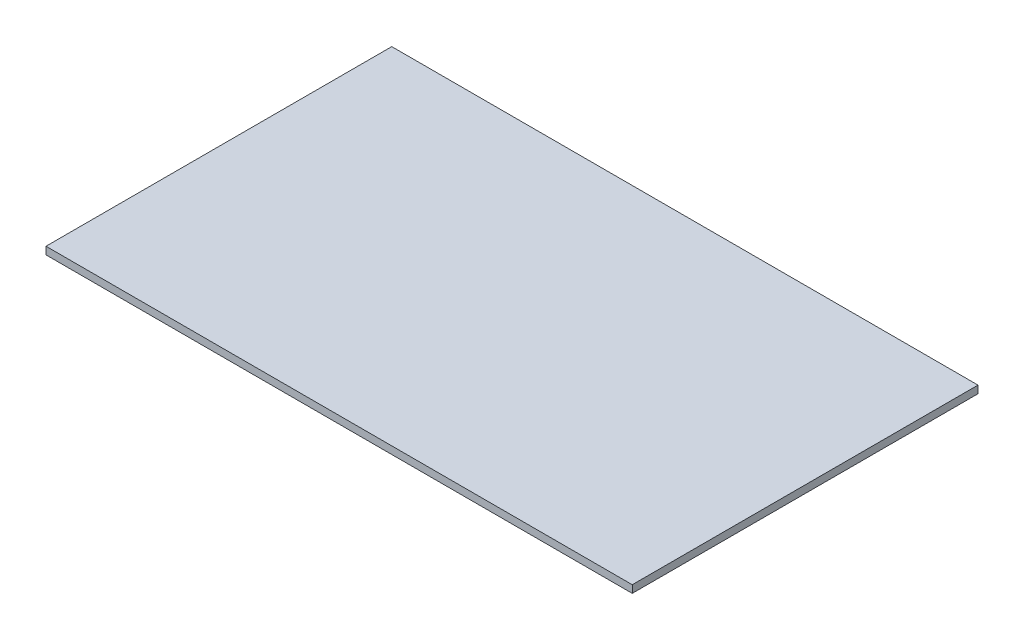
ISO-10303-21;
HEADER;
FILE_DESCRIPTION(('STEP AP214'),'2;1');
FILE_NAME('part.step','',(''),(''),'','','');
FILE_SCHEMA(('AUTOMOTIVE_DESIGN { 1 0 10303 214 1 1 1 1 }'));
ENDSEC;
DATA;
#1=APPLICATION_CONTEXT('core data for automotive mechanical design processes');
#2=APPLICATION_PROTOCOL_DEFINITION('international standard','automotive_design',2000,#1);
#3=PRODUCT_CONTEXT('',#1,'mechanical');
#4=PRODUCT('Part','Part','',(#3));
#5=PRODUCT_RELATED_PRODUCT_CATEGORY('part','',(#4));
#6=PRODUCT_DEFINITION_FORMATION('','',#4);
#7=PRODUCT_DEFINITION_CONTEXT('part definition',#1,'design');
#8=PRODUCT_DEFINITION('design','',#6,#7);
#9=PRODUCT_DEFINITION_SHAPE('','',#8);
#10=(LENGTH_UNIT() NAMED_UNIT(*) SI_UNIT(.MILLI.,.METRE.));
#11=(NAMED_UNIT(*) PLANE_ANGLE_UNIT() SI_UNIT($,.RADIAN.));
#12=(NAMED_UNIT(*) SI_UNIT($,.STERADIAN.) SOLID_ANGLE_UNIT());
#13=UNCERTAINTY_MEASURE_WITH_UNIT(LENGTH_MEASURE(1.E-05),#10,'distance_accuracy_value','');
#14=(GEOMETRIC_REPRESENTATION_CONTEXT(3) GLOBAL_UNCERTAINTY_ASSIGNED_CONTEXT((#13)) GLOBAL_UNIT_ASSIGNED_CONTEXT((#10,
#11,#12)) REPRESENTATION_CONTEXT('',''));
#15=CARTESIAN_POINT('',(0.,0.,0.));
#16=DIRECTION('',(0.,0.,1.));
#17=DIRECTION('',(1.,0.,0.));
#18=AXIS2_PLACEMENT_3D('',#15,#16,#17);
#19=CARTESIAN_POINT('',(39.,1.,-23.));
#20=DIRECTION('',(-1.,0.,0.));
#21=DIRECTION('',(0.,0.,1.));
#22=AXIS2_PLACEMENT_3D('',#19,#20,#21);
#23=PLANE('',#22);
#24=DIRECTION('',(0.,0.,-1.));
#25=VECTOR('',#24,1.);
#26=CARTESIAN_POINT('',(39.,0.,-23.));
#27=LINE('',#26,#25);
#28=CARTESIAN_POINT('',(39.,0.,23.));
#29=VERTEX_POINT('',#28);
#30=CARTESIAN_POINT('',(39.,0.,-23.));
#31=VERTEX_POINT('',#30);
#32=EDGE_CURVE('E96',#29,#31,#27,.T.);
#33=ORIENTED_EDGE('',*,*,#32,.T.);
#34=DIRECTION('',(0.,-1.,0.));
#35=VECTOR('',#34,1.);
#36=CARTESIAN_POINT('',(39.,1.,-23.));
#37=LINE('',#36,#35);
#38=CARTESIAN_POINT('',(39.,1.,-23.));
#39=VERTEX_POINT('',#38);
#40=EDGE_CURVE('E11',#39,#31,#37,.T.);
#41=ORIENTED_EDGE('',*,*,#40,.F.);
#42=DIRECTION('',(0.,0.,-1.));
#43=VECTOR('',#42,1.);
#44=CARTESIAN_POINT('',(39.,1.,-23.));
#45=LINE('',#44,#43);
#46=CARTESIAN_POINT('',(39.,1.,23.));
#47=VERTEX_POINT('',#46);
#48=EDGE_CURVE('E84',#47,#39,#45,.T.);
#49=ORIENTED_EDGE('',*,*,#48,.F.);
#50=DIRECTION('',(0.,-1.,0.));
#51=VECTOR('',#50,1.);
#52=CARTESIAN_POINT('',(39.,1.,23.));
#53=LINE('',#52,#51);
#54=EDGE_CURVE('E92',#47,#29,#53,.T.);
#55=ORIENTED_EDGE('',*,*,#54,.T.);
#56=EDGE_LOOP('',(#33,#41,#49,#55));
#57=FACE_BOUND('',#56,.T.);
#58=ADVANCED_FACE('F33',(#57),#23,.F.);
#59=CARTESIAN_POINT('',(-39.,1.,-23.));
#60=DIRECTION('',(0.,0.,1.));
#61=DIRECTION('',(1.,0.,0.));
#62=AXIS2_PLACEMENT_3D('',#59,#60,#61);
#63=PLANE('',#62);
#64=DIRECTION('',(-1.,0.,0.));
#65=VECTOR('',#64,1.);
#66=CARTESIAN_POINT('',(-39.,0.,-23.));
#67=LINE('',#66,#65);
#68=CARTESIAN_POINT('',(-39.,0.,-23.));
#69=VERTEX_POINT('',#68);
#70=EDGE_CURVE('E88',#31,#69,#67,.T.);
#71=ORIENTED_EDGE('',*,*,#70,.T.);
#72=DIRECTION('',(0.,-1.,0.));
#73=VECTOR('',#72,1.);
#74=CARTESIAN_POINT('',(-39.,1.,-23.));
#75=LINE('',#74,#73);
#76=CARTESIAN_POINT('',(-39.,1.,-23.));
#77=VERTEX_POINT('',#76);
#78=EDGE_CURVE('E41',#77,#69,#75,.T.);
#79=ORIENTED_EDGE('',*,*,#78,.F.);
#80=DIRECTION('',(-1.,0.,0.));
#81=VECTOR('',#80,1.);
#82=CARTESIAN_POINT('',(-39.,1.,-23.));
#83=LINE('',#82,#81);
#84=EDGE_CURVE('E79',#39,#77,#83,.T.);
#85=ORIENTED_EDGE('',*,*,#84,.F.);
#86=ORIENTED_EDGE('',*,*,#40,.T.);
#87=EDGE_LOOP('',(#71,#79,#85,#86));
#88=FACE_BOUND('',#87,.T.);
#89=ADVANCED_FACE('F87',(#88),#63,.F.);
#90=CARTESIAN_POINT('',(-39.,1.,-23.));
#91=DIRECTION('',(1.,0.,0.));
#92=DIRECTION('',(0.,0.,-1.));
#93=AXIS2_PLACEMENT_3D('',#90,#91,#92);
#94=PLANE('',#93);
#95=DIRECTION('',(0.,0.,1.));
#96=VECTOR('',#95,1.);
#97=CARTESIAN_POINT('',(-39.,0.,-23.));
#98=LINE('',#97,#96);
#99=CARTESIAN_POINT('',(-39.,0.,23.));
#100=VERTEX_POINT('',#99);
#101=EDGE_CURVE('E66',#69,#100,#98,.T.);
#102=ORIENTED_EDGE('',*,*,#101,.T.);
#103=DIRECTION('',(0.,-1.,0.));
#104=VECTOR('',#103,1.);
#105=CARTESIAN_POINT('',(-39.,1.,23.));
#106=LINE('',#105,#104);
#107=CARTESIAN_POINT('',(-39.,1.,23.));
#108=VERTEX_POINT('',#107);
#109=EDGE_CURVE('E89',#108,#100,#106,.T.);
#110=ORIENTED_EDGE('',*,*,#109,.F.);
#111=DIRECTION('',(0.,0.,1.));
#112=VECTOR('',#111,1.);
#113=CARTESIAN_POINT('',(-39.,1.,-23.));
#114=LINE('',#113,#112);
#115=EDGE_CURVE('E82',#77,#108,#114,.T.);
#116=ORIENTED_EDGE('',*,*,#115,.F.);
#117=ORIENTED_EDGE('',*,*,#78,.T.);
#118=EDGE_LOOP('',(#102,#110,#116,#117));
#119=FACE_BOUND('',#118,.T.);
#120=ADVANCED_FACE('F90',(#119),#94,.F.);
#121=CARTESIAN_POINT('',(-39.,1.,23.));
#122=DIRECTION('',(0.,0.,-1.));
#123=DIRECTION('',(-1.,0.,0.));
#124=AXIS2_PLACEMENT_3D('',#121,#122,#123);
#125=PLANE('',#124);
#126=DIRECTION('',(1.,0.,0.));
#127=VECTOR('',#126,1.);
#128=CARTESIAN_POINT('',(-39.,0.,23.));
#129=LINE('',#128,#127);
#130=EDGE_CURVE('E72',#100,#29,#129,.T.);
#131=ORIENTED_EDGE('',*,*,#130,.T.);
#132=ORIENTED_EDGE('',*,*,#54,.F.);
#133=DIRECTION('',(1.,0.,0.));
#134=VECTOR('',#133,1.);
#135=CARTESIAN_POINT('',(-39.,1.,23.));
#136=LINE('',#135,#134);
#137=EDGE_CURVE('E49',#108,#47,#136,.T.);
#138=ORIENTED_EDGE('',*,*,#137,.F.);
#139=ORIENTED_EDGE('',*,*,#109,.T.);
#140=EDGE_LOOP('',(#131,#132,#138,#139));
#141=FACE_BOUND('',#140,.T.);
#142=ADVANCED_FACE('F103',(#141),#125,.F.);
#143=CARTESIAN_POINT('',(0.,1.,0.));
#144=DIRECTION('',(0.,1.,0.));
#145=DIRECTION('',(0.,0.,1.));
#146=AXIS2_PLACEMENT_3D('',#143,#144,#145);
#147=PLANE('',#146);
#148=ORIENTED_EDGE('',*,*,#48,.T.);
#149=ORIENTED_EDGE('',*,*,#84,.T.);
#150=ORIENTED_EDGE('',*,*,#115,.T.);
#151=ORIENTED_EDGE('',*,*,#137,.T.);
#152=EDGE_LOOP('',(#148,#149,#150,#151));
#153=FACE_BOUND('',#152,.T.);
#154=ADVANCED_FACE('F80',(#153),#147,.T.);
#155=CARTESIAN_POINT('',(0.,0.,0.));
#156=DIRECTION('',(0.,1.,0.));
#157=DIRECTION('',(0.,0.,1.));
#158=AXIS2_PLACEMENT_3D('',#155,#156,#157);
#159=PLANE('',#158);
#160=ORIENTED_EDGE('',*,*,#32,.F.);
#161=ORIENTED_EDGE('',*,*,#130,.F.);
#162=ORIENTED_EDGE('',*,*,#101,.F.);
#163=ORIENTED_EDGE('',*,*,#70,.F.);
#164=EDGE_LOOP('',(#160,#161,#162,#163));
#165=FACE_BOUND('',#164,.T.);
#166=ADVANCED_FACE('F106',(#165),#159,.F.);
#167=CLOSED_SHELL('',(#58,#89,#120,#142,#154,#166));
#168=MANIFOLD_SOLID_BREP('B2',#167);
#169=ADVANCED_BREP_SHAPE_REPRESENTATION('',(#18,#168),#14);
#170=SHAPE_DEFINITION_REPRESENTATION(#9,#169);
ENDSEC;
END-ISO-10303-21;
